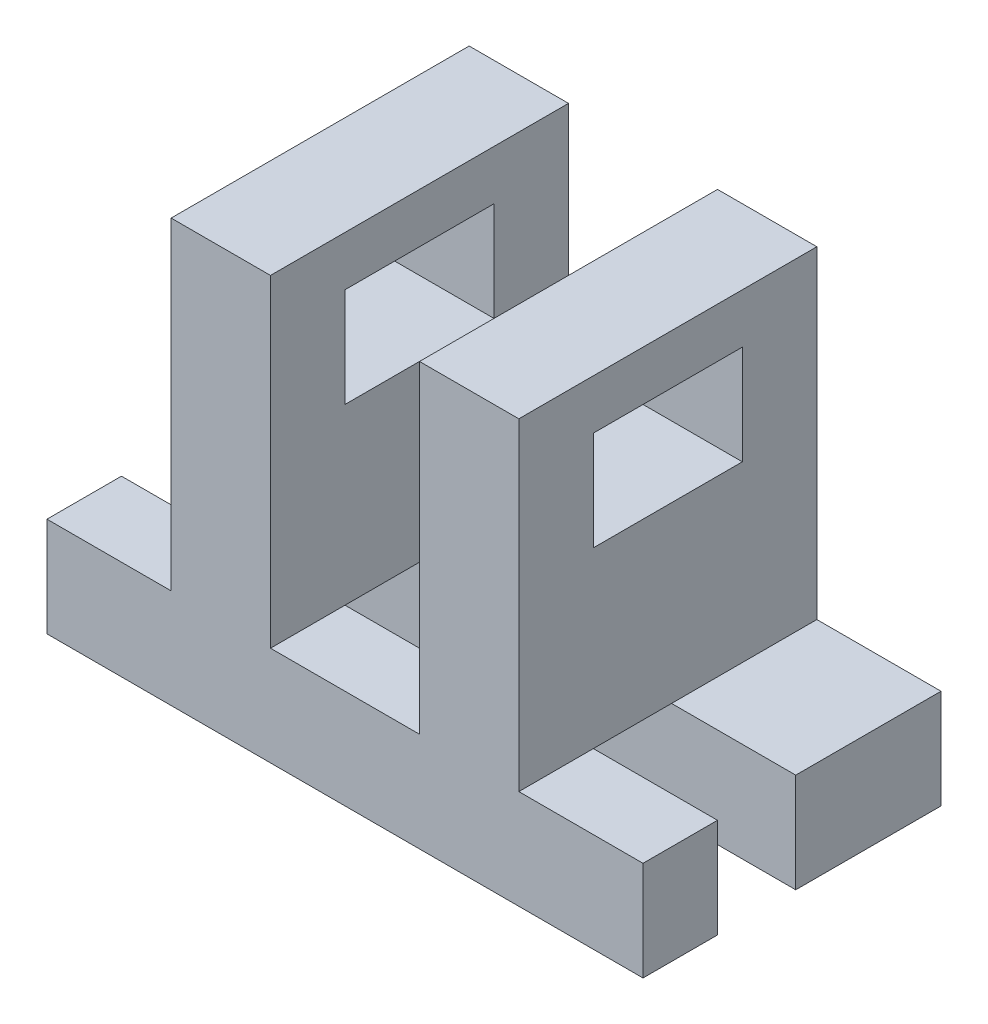
ISO-10303-21;
HEADER;
FILE_DESCRIPTION(('STEP AP214'),'2;1');
FILE_NAME('part.step','',(''),(''),'','','');
FILE_SCHEMA(('AUTOMOTIVE_DESIGN { 1 0 10303 214 1 1 1 1 }'));
ENDSEC;
DATA;
#1=APPLICATION_CONTEXT('core data for automotive mechanical design processes');
#2=APPLICATION_PROTOCOL_DEFINITION('international standard','automotive_design',2000,#1);
#3=PRODUCT_CONTEXT('',#1,'mechanical');
#4=PRODUCT('Part','Part','',(#3));
#5=PRODUCT_RELATED_PRODUCT_CATEGORY('part','',(#4));
#6=PRODUCT_DEFINITION_FORMATION('','',#4);
#7=PRODUCT_DEFINITION_CONTEXT('part definition',#1,'design');
#8=PRODUCT_DEFINITION('design','',#6,#7);
#9=PRODUCT_DEFINITION_SHAPE('','',#8);
#10=(LENGTH_UNIT() NAMED_UNIT(*) SI_UNIT(.MILLI.,.METRE.));
#11=(NAMED_UNIT(*) PLANE_ANGLE_UNIT() SI_UNIT($,.RADIAN.));
#12=(NAMED_UNIT(*) SI_UNIT($,.STERADIAN.) SOLID_ANGLE_UNIT());
#13=UNCERTAINTY_MEASURE_WITH_UNIT(LENGTH_MEASURE(1.E-05),#10,'distance_accuracy_value','');
#14=(GEOMETRIC_REPRESENTATION_CONTEXT(3) GLOBAL_UNCERTAINTY_ASSIGNED_CONTEXT((#13)) GLOBAL_UNIT_ASSIGNED_CONTEXT((#10,
#11,#12)) REPRESENTATION_CONTEXT('',''));
#15=CARTESIAN_POINT('',(0.,0.,0.));
#16=DIRECTION('',(0.,0.,1.));
#17=DIRECTION('',(1.,0.,0.));
#18=AXIS2_PLACEMENT_3D('',#15,#16,#17);
#19=CARTESIAN_POINT('',(3.5,1.,3.));
#20=DIRECTION('',(0.,-1.,0.));
#21=DIRECTION('',(1.,0.,0.));
#22=AXIS2_PLACEMENT_3D('',#19,#20,#21);
#23=PLANE('',#22);
#24=DIRECTION('',(-1.,0.,0.));
#25=VECTOR('',#24,1.);
#26=CARTESIAN_POINT('',(0.,1.,1.5));
#27=LINE('',#26,#25);
#28=CARTESIAN_POINT('',(6.,1.,1.5));
#29=VERTEX_POINT('',#28);
#30=CARTESIAN_POINT('',(3.5,1.,1.5));
#31=VERTEX_POINT('',#30);
#32=EDGE_CURVE('E268',#29,#31,#27,.T.);
#33=ORIENTED_EDGE('',*,*,#32,.T.);
#34=DIRECTION('',(0.,0.,-1.));
#35=VECTOR('',#34,1.);
#36=CARTESIAN_POINT('',(3.5,1.,3.));
#37=LINE('',#36,#35);
#38=CARTESIAN_POINT('',(3.5,1.,3.));
#39=VERTEX_POINT('',#38);
#40=EDGE_CURVE('E392',#39,#31,#37,.T.);
#41=ORIENTED_EDGE('',*,*,#40,.F.);
#42=DIRECTION('',(-1.,0.,0.));
#43=VECTOR('',#42,1.);
#44=CARTESIAN_POINT('',(3.5,1.,3.));
#45=LINE('',#44,#43);
#46=CARTESIAN_POINT('',(6.,0.999999999999999,3.));
#47=VERTEX_POINT('',#46);
#48=EDGE_CURVE('E295',#47,#39,#45,.T.);
#49=ORIENTED_EDGE('',*,*,#48,.F.);
#50=DIRECTION('',(0.,0.,-1.));
#51=VECTOR('',#50,1.);
#52=CARTESIAN_POINT('',(6.,0.999999999999999,3.));
#53=LINE('',#52,#51);
#54=EDGE_CURVE('E352',#47,#29,#53,.T.);
#55=ORIENTED_EDGE('',*,*,#54,.T.);
#56=EDGE_LOOP('',(#33,#41,#49,#55));
#57=FACE_BOUND('',#56,.T.);
#58=ADVANCED_FACE('F34',(#57),#23,.F.);
#59=CARTESIAN_POINT('',(-1.5,1.,3.));
#60=DIRECTION('',(0.,-1.,0.));
#61=DIRECTION('',(1.,0.,0.));
#62=AXIS2_PLACEMENT_3D('',#59,#60,#61);
#63=PLANE('',#62);
#64=CARTESIAN_POINT('',(1.5,1.,1.5));
#65=VERTEX_POINT('',#64);
#66=CARTESIAN_POINT('',(-1.5,1.,1.5));
#67=VERTEX_POINT('',#66);
#68=EDGE_CURVE('E483',#65,#67,#27,.T.);
#69=ORIENTED_EDGE('',*,*,#68,.T.);
#70=DIRECTION('',(0.,0.,-1.));
#71=VECTOR('',#70,1.);
#72=CARTESIAN_POINT('',(-1.5,1.,3.));
#73=LINE('',#72,#71);
#74=CARTESIAN_POINT('',(-1.5,1.,3.));
#75=VERTEX_POINT('',#74);
#76=EDGE_CURVE('E378',#75,#67,#73,.T.);
#77=ORIENTED_EDGE('',*,*,#76,.F.);
#78=DIRECTION('',(-1.,0.,0.));
#79=VECTOR('',#78,1.);
#80=CARTESIAN_POINT('',(-1.5,1.,3.));
#81=LINE('',#80,#79);
#82=CARTESIAN_POINT('',(1.5,1.,3.));
#83=VERTEX_POINT('',#82);
#84=EDGE_CURVE('E305',#83,#75,#81,.T.);
#85=ORIENTED_EDGE('',*,*,#84,.F.);
#86=DIRECTION('',(0.,0.,-1.));
#87=VECTOR('',#86,1.);
#88=CARTESIAN_POINT('',(1.5,1.,3.));
#89=LINE('',#88,#87);
#90=EDGE_CURVE('E382',#83,#65,#89,.T.);
#91=ORIENTED_EDGE('',*,*,#90,.T.);
#92=EDGE_LOOP('',(#69,#77,#85,#91));
#93=FACE_BOUND('',#92,.T.);
#94=ADVANCED_FACE('F444',(#93),#63,.F.);
#95=CARTESIAN_POINT('',(-6.,1.,3.));
#96=DIRECTION('',(0.,-1.,0.));
#97=DIRECTION('',(0.,0.,-1.));
#98=AXIS2_PLACEMENT_3D('',#95,#96,#97);
#99=PLANE('',#98);
#100=CARTESIAN_POINT('',(-3.5,1.,1.5));
#101=VERTEX_POINT('',#100);
#102=CARTESIAN_POINT('',(-6.,0.999999999999999,1.5));
#103=VERTEX_POINT('',#102);
#104=EDGE_CURVE('E265',#101,#103,#27,.T.);
#105=ORIENTED_EDGE('',*,*,#104,.T.);
#106=DIRECTION('',(0.,0.,-1.));
#107=VECTOR('',#106,1.);
#108=CARTESIAN_POINT('',(-6.,1.,3.));
#109=LINE('',#108,#107);
#110=CARTESIAN_POINT('',(-6.,1.,3.));
#111=VERTEX_POINT('',#110);
#112=EDGE_CURVE('E364',#111,#103,#109,.T.);
#113=ORIENTED_EDGE('',*,*,#112,.F.);
#114=DIRECTION('',(-1.,0.,0.));
#115=VECTOR('',#114,1.);
#116=CARTESIAN_POINT('',(-6.,1.,3.));
#117=LINE('',#116,#115);
#118=CARTESIAN_POINT('',(-3.5,1.,3.));
#119=VERTEX_POINT('',#118);
#120=EDGE_CURVE('E313',#119,#111,#117,.T.);
#121=ORIENTED_EDGE('',*,*,#120,.F.);
#122=DIRECTION('',(0.,0.,-1.));
#123=VECTOR('',#122,1.);
#124=CARTESIAN_POINT('',(-3.5,1.,3.));
#125=LINE('',#124,#123);
#126=EDGE_CURVE('E368',#119,#101,#125,.T.);
#127=ORIENTED_EDGE('',*,*,#126,.T.);
#128=EDGE_LOOP('',(#105,#113,#121,#127));
#129=FACE_BOUND('',#128,.T.);
#130=ADVANCED_FACE('F449',(#129),#99,.F.);
#131=CARTESIAN_POINT('',(-6.,-1.,3.));
#132=DIRECTION('',(1.,0.,0.));
#133=DIRECTION('',(0.,0.,-1.));
#134=AXIS2_PLACEMENT_3D('',#131,#132,#133);
#135=PLANE('',#134);
#136=DIRECTION('',(0.,-1.,0.));
#137=VECTOR('',#136,1.);
#138=CARTESIAN_POINT('',(-6.,13.1028920114161,1.5));
#139=LINE('',#138,#137);
#140=CARTESIAN_POINT('',(-6.,-1.,1.5));
#141=VERTEX_POINT('',#140);
#142=EDGE_CURVE('E277',#103,#141,#139,.T.);
#143=ORIENTED_EDGE('',*,*,#142,.T.);
#144=DIRECTION('',(0.,0.,-1.));
#145=VECTOR('',#144,1.);
#146=CARTESIAN_POINT('',(-6.,-1.,3.));
#147=LINE('',#146,#145);
#148=CARTESIAN_POINT('',(-6.,-1.,3.));
#149=VERTEX_POINT('',#148);
#150=EDGE_CURVE('E360',#149,#141,#147,.T.);
#151=ORIENTED_EDGE('',*,*,#150,.F.);
#152=DIRECTION('',(0.,-1.,0.));
#153=VECTOR('',#152,1.);
#154=CARTESIAN_POINT('',(-6.,-1.,3.));
#155=LINE('',#154,#153);
#156=EDGE_CURVE('E315',#111,#149,#155,.T.);
#157=ORIENTED_EDGE('',*,*,#156,.F.);
#158=ORIENTED_EDGE('',*,*,#112,.T.);
#159=EDGE_LOOP('',(#143,#151,#157,#158));
#160=FACE_BOUND('',#159,.T.);
#161=ADVANCED_FACE('F493',(#160),#135,.F.);
#162=CARTESIAN_POINT('',(-6.,-1.,3.));
#163=DIRECTION('',(0.,1.,0.));
#164=DIRECTION('',(-1.,0.,0.));
#165=AXIS2_PLACEMENT_3D('',#162,#163,#164);
#166=PLANE('',#165);
#167=DIRECTION('',(1.,0.,0.));
#168=VECTOR('',#167,1.);
#169=CARTESIAN_POINT('',(0.,-1.,1.5));
#170=LINE('',#169,#168);
#171=CARTESIAN_POINT('',(6.,-0.999999999999999,1.5));
#172=VERTEX_POINT('',#171);
#173=EDGE_CURVE('E261',#141,#172,#170,.T.);
#174=ORIENTED_EDGE('',*,*,#173,.T.);
#175=DIRECTION('',(0.,0.,-1.));
#176=VECTOR('',#175,1.);
#177=CARTESIAN_POINT('',(6.,-0.999999999999999,3.));
#178=LINE('',#177,#176);
#179=CARTESIAN_POINT('',(6.,-0.999999999999999,3.));
#180=VERTEX_POINT('',#179);
#181=EDGE_CURVE('E356',#180,#172,#178,.T.);
#182=ORIENTED_EDGE('',*,*,#181,.F.);
#183=DIRECTION('',(1.,0.,0.));
#184=VECTOR('',#183,1.);
#185=CARTESIAN_POINT('',(-6.,-1.,3.));
#186=LINE('',#185,#184);
#187=EDGE_CURVE('E317',#149,#180,#186,.T.);
#188=ORIENTED_EDGE('',*,*,#187,.F.);
#189=ORIENTED_EDGE('',*,*,#150,.T.);
#190=EDGE_LOOP('',(#174,#182,#188,#189));
#191=FACE_BOUND('',#190,.T.);
#192=ADVANCED_FACE('F461',(#191),#166,.F.);
#193=CARTESIAN_POINT('',(6.,-0.999999999999999,3.));
#194=DIRECTION('',(-1.,0.,0.));
#195=DIRECTION('',(0.,0.,1.));
#196=AXIS2_PLACEMENT_3D('',#193,#194,#195);
#197=PLANE('',#196);
#198=DIRECTION('',(0.,-1.,0.));
#199=VECTOR('',#198,1.);
#200=CARTESIAN_POINT('',(6.,13.1028920114161,1.5));
#201=LINE('',#200,#199);
#202=EDGE_CURVE('E278',#29,#172,#201,.T.);
#203=ORIENTED_EDGE('',*,*,#202,.F.);
#204=ORIENTED_EDGE('',*,*,#54,.F.);
#205=DIRECTION('',(0.,1.,0.));
#206=VECTOR('',#205,1.);
#207=CARTESIAN_POINT('',(6.,-0.999999999999999,3.));
#208=LINE('',#207,#206);
#209=EDGE_CURVE('E319',#180,#47,#208,.T.);
#210=ORIENTED_EDGE('',*,*,#209,.F.);
#211=ORIENTED_EDGE('',*,*,#181,.T.);
#212=EDGE_LOOP('',(#203,#204,#210,#211));
#213=FACE_BOUND('',#212,.T.);
#214=ADVANCED_FACE('F454',(#213),#197,.F.);
#215=CARTESIAN_POINT('',(3.5,1.,-0.0747999999999999));
#216=VERTEX_POINT('',#215);
#217=CARTESIAN_POINT('',(3.5,1.,-3.));
#218=VERTEX_POINT('',#217);
#219=EDGE_CURVE('E391',#216,#218,#37,.T.);
#220=ORIENTED_EDGE('',*,*,#219,.F.);
#221=DIRECTION('',(-1.,0.,0.));
#222=VECTOR('',#221,1.);
#223=CARTESIAN_POINT('',(0.,1.,-0.0747999999999999));
#224=LINE('',#223,#222);
#225=CARTESIAN_POINT('',(6.,1.,-0.0747999999999999));
#226=VERTEX_POINT('',#225);
#227=EDGE_CURVE('E262',#226,#216,#224,.T.);
#228=ORIENTED_EDGE('',*,*,#227,.F.);
#229=CARTESIAN_POINT('',(6.,0.999999999999999,-3.));
#230=VERTEX_POINT('',#229);
#231=EDGE_CURVE('E321',#226,#230,#53,.T.);
#232=ORIENTED_EDGE('',*,*,#231,.T.);
#233=DIRECTION('',(-1.,0.,0.));
#234=VECTOR('',#233,1.);
#235=CARTESIAN_POINT('',(3.5,1.,-3.));
#236=LINE('',#235,#234);
#237=EDGE_CURVE('E294',#230,#218,#236,.T.);
#238=ORIENTED_EDGE('',*,*,#237,.T.);
#239=EDGE_LOOP('',(#220,#228,#232,#238));
#240=FACE_BOUND('',#239,.T.);
#241=ADVANCED_FACE('F36',(#240),#23,.F.);
#242=CARTESIAN_POINT('',(3.5,7.5,3.));
#243=DIRECTION('',(-1.,0.,0.));
#244=DIRECTION('',(0.,-1.,0.));
#245=AXIS2_PLACEMENT_3D('',#242,#243,#244);
#246=PLANE('',#245);
#247=DIRECTION('',(0.,0.,-1.));
#248=VECTOR('',#247,1.);
#249=CARTESIAN_POINT('',(3.5,6.5,3.));
#250=LINE('',#249,#248);
#251=CARTESIAN_POINT('',(3.5,6.5,1.5));
#252=VERTEX_POINT('',#251);
#253=CARTESIAN_POINT('',(3.5,6.5,-1.5));
#254=VERTEX_POINT('',#253);
#255=EDGE_CURVE('E250',#252,#254,#250,.T.);
#256=ORIENTED_EDGE('',*,*,#255,.T.);
#257=DIRECTION('',(0.,-1.,0.));
#258=VECTOR('',#257,1.);
#259=CARTESIAN_POINT('',(3.5,7.5,-1.5));
#260=LINE('',#259,#258);
#261=CARTESIAN_POINT('',(3.5,4.5,-1.5));
#262=VERTEX_POINT('',#261);
#263=EDGE_CURVE('E258',#254,#262,#260,.T.);
#264=ORIENTED_EDGE('',*,*,#263,.T.);
#265=DIRECTION('',(0.,0.,1.));
#266=VECTOR('',#265,1.);
#267=CARTESIAN_POINT('',(3.5,4.5,3.));
#268=LINE('',#267,#266);
#269=CARTESIAN_POINT('',(3.5,4.5,1.5));
#270=VERTEX_POINT('',#269);
#271=EDGE_CURVE('E221',#262,#270,#268,.T.);
#272=ORIENTED_EDGE('',*,*,#271,.T.);
#273=DIRECTION('',(0.,1.,0.));
#274=VECTOR('',#273,1.);
#275=CARTESIAN_POINT('',(3.5,7.5,1.5));
#276=LINE('',#275,#274);
#277=EDGE_CURVE('E230',#270,#252,#276,.T.);
#278=ORIENTED_EDGE('',*,*,#277,.T.);
#279=EDGE_LOOP('',(#256,#264,#272,#278));
#280=FACE_BOUND('',#279,.T.);
#281=DIRECTION('',(0.,1.,0.));
#282=VECTOR('',#281,1.);
#283=CARTESIAN_POINT('',(3.5,7.5,-3.));
#284=LINE('',#283,#282);
#285=CARTESIAN_POINT('',(3.5,7.5,-3.));
#286=VERTEX_POINT('',#285);
#287=EDGE_CURVE('E324',#218,#286,#284,.T.);
#288=ORIENTED_EDGE('',*,*,#287,.T.);
#289=DIRECTION('',(0.,0.,-1.));
#290=VECTOR('',#289,1.);
#291=CARTESIAN_POINT('',(3.5,7.5,3.));
#292=LINE('',#291,#290);
#293=CARTESIAN_POINT('',(3.5,7.5,3.));
#294=VERTEX_POINT('',#293);
#295=EDGE_CURVE('E388',#294,#286,#292,.T.);
#296=ORIENTED_EDGE('',*,*,#295,.F.);
#297=DIRECTION('',(0.,1.,0.));
#298=VECTOR('',#297,1.);
#299=CARTESIAN_POINT('',(3.5,7.5,3.));
#300=LINE('',#299,#298);
#301=EDGE_CURVE('E298',#39,#294,#300,.T.);
#302=ORIENTED_EDGE('',*,*,#301,.F.);
#303=ORIENTED_EDGE('',*,*,#40,.T.);
#304=DIRECTION('',(0.,0.,1.));
#305=VECTOR('',#304,1.);
#306=CARTESIAN_POINT('',(3.5,1.,3.));
#307=LINE('',#306,#305);
#308=EDGE_CURVE('E292',#216,#31,#307,.T.);
#309=ORIENTED_EDGE('',*,*,#308,.F.);
#310=ORIENTED_EDGE('',*,*,#219,.T.);
#311=EDGE_LOOP('',(#288,#296,#302,#303,#309,#310));
#312=FACE_BOUND('',#311,.T.);
#313=ADVANCED_FACE('F426',(#280,#312),#246,.F.);
#314=CARTESIAN_POINT('',(1.5,7.5,3.));
#315=DIRECTION('',(0.,-1.,0.));
#316=DIRECTION('',(0.,0.,-1.));
#317=AXIS2_PLACEMENT_3D('',#314,#315,#316);
#318=PLANE('',#317);
#319=DIRECTION('',(-1.,0.,0.));
#320=VECTOR('',#319,1.);
#321=CARTESIAN_POINT('',(1.5,7.5,-3.));
#322=LINE('',#321,#320);
#323=CARTESIAN_POINT('',(1.5,7.5,-3.));
#324=VERTEX_POINT('',#323);
#325=EDGE_CURVE('E326',#286,#324,#322,.T.);
#326=ORIENTED_EDGE('',*,*,#325,.T.);
#327=DIRECTION('',(0.,0.,-1.));
#328=VECTOR('',#327,1.);
#329=CARTESIAN_POINT('',(1.5,7.5,3.));
#330=LINE('',#329,#328);
#331=CARTESIAN_POINT('',(1.5,7.5,3.));
#332=VERTEX_POINT('',#331);
#333=EDGE_CURVE('E385',#332,#324,#330,.T.);
#334=ORIENTED_EDGE('',*,*,#333,.F.);
#335=DIRECTION('',(-1.,0.,0.));
#336=VECTOR('',#335,1.);
#337=CARTESIAN_POINT('',(1.5,7.5,3.));
#338=LINE('',#337,#336);
#339=EDGE_CURVE('E301',#294,#332,#338,.T.);
#340=ORIENTED_EDGE('',*,*,#339,.F.);
#341=ORIENTED_EDGE('',*,*,#295,.T.);
#342=EDGE_LOOP('',(#326,#334,#340,#341));
#343=FACE_BOUND('',#342,.T.);
#344=ADVANCED_FACE('F460',(#343),#318,.F.);
#345=CARTESIAN_POINT('',(1.5,7.5,3.));
#346=DIRECTION('',(1.,0.,0.));
#347=DIRECTION('',(0.,1.,0.));
#348=AXIS2_PLACEMENT_3D('',#345,#346,#347);
#349=PLANE('',#348);
#350=DIRECTION('',(0.,0.,-1.));
#351=VECTOR('',#350,1.);
#352=CARTESIAN_POINT('',(1.5,4.5,3.));
#353=LINE('',#352,#351);
#354=CARTESIAN_POINT('',(1.5,4.5,1.5));
#355=VERTEX_POINT('',#354);
#356=CARTESIAN_POINT('',(1.5,4.5,-1.5));
#357=VERTEX_POINT('',#356);
#358=EDGE_CURVE('E216',#355,#357,#353,.T.);
#359=ORIENTED_EDGE('',*,*,#358,.T.);
#360=DIRECTION('',(0.,1.,0.));
#361=VECTOR('',#360,1.);
#362=CARTESIAN_POINT('',(1.5,7.5,-1.5));
#363=LINE('',#362,#361);
#364=CARTESIAN_POINT('',(1.5,6.5,-1.5));
#365=VERTEX_POINT('',#364);
#366=EDGE_CURVE('E256',#357,#365,#363,.T.);
#367=ORIENTED_EDGE('',*,*,#366,.T.);
#368=DIRECTION('',(0.,0.,1.));
#369=VECTOR('',#368,1.);
#370=CARTESIAN_POINT('',(1.5,6.5,3.));
#371=LINE('',#370,#369);
#372=CARTESIAN_POINT('',(1.5,6.5,1.5));
#373=VERTEX_POINT('',#372);
#374=EDGE_CURVE('E238',#365,#373,#371,.T.);
#375=ORIENTED_EDGE('',*,*,#374,.T.);
#376=DIRECTION('',(0.,-1.,0.));
#377=VECTOR('',#376,1.);
#378=CARTESIAN_POINT('',(1.5,7.5,1.5));
#379=LINE('',#378,#377);
#380=EDGE_CURVE('E227',#373,#355,#379,.T.);
#381=ORIENTED_EDGE('',*,*,#380,.T.);
#382=EDGE_LOOP('',(#359,#367,#375,#381));
#383=FACE_BOUND('',#382,.T.);
#384=DIRECTION('',(0.,-1.,0.));
#385=VECTOR('',#384,1.);
#386=CARTESIAN_POINT('',(1.5,7.5,-3.));
#387=LINE('',#386,#385);
#388=CARTESIAN_POINT('',(1.5,1.,-3.));
#389=VERTEX_POINT('',#388);
#390=EDGE_CURVE('E328',#324,#389,#387,.T.);
#391=ORIENTED_EDGE('',*,*,#390,.T.);
#392=CARTESIAN_POINT('',(1.5,1.,-0.0747999999999999));
#393=VERTEX_POINT('',#392);
#394=EDGE_CURVE('E381',#393,#389,#89,.T.);
#395=ORIENTED_EDGE('',*,*,#394,.F.);
#396=DIRECTION('',(0.,0.,-1.));
#397=VECTOR('',#396,1.);
#398=CARTESIAN_POINT('',(1.5,1.,3.));
#399=LINE('',#398,#397);
#400=EDGE_CURVE('E290',#65,#393,#399,.T.);
#401=ORIENTED_EDGE('',*,*,#400,.F.);
#402=ORIENTED_EDGE('',*,*,#90,.F.);
#403=DIRECTION('',(0.,-1.,0.));
#404=VECTOR('',#403,1.);
#405=CARTESIAN_POINT('',(1.5,7.5,3.));
#406=LINE('',#405,#404);
#407=EDGE_CURVE('E303',#332,#83,#406,.T.);
#408=ORIENTED_EDGE('',*,*,#407,.F.);
#409=ORIENTED_EDGE('',*,*,#333,.T.);
#410=EDGE_LOOP('',(#391,#395,#401,#402,#408,#409));
#411=FACE_BOUND('',#410,.T.);
#412=ADVANCED_FACE('F236',(#383,#411),#349,.F.);
#413=CARTESIAN_POINT('',(-1.5,1.,-0.0747999999999999));
#414=VERTEX_POINT('',#413);
#415=CARTESIAN_POINT('',(-1.5,1.,-3.));
#416=VERTEX_POINT('',#415);
#417=EDGE_CURVE('E377',#414,#416,#73,.T.);
#418=ORIENTED_EDGE('',*,*,#417,.F.);
#419=EDGE_CURVE('E523',#393,#414,#224,.T.);
#420=ORIENTED_EDGE('',*,*,#419,.F.);
#421=ORIENTED_EDGE('',*,*,#394,.T.);
#422=DIRECTION('',(-1.,0.,0.));
#423=VECTOR('',#422,1.);
#424=CARTESIAN_POINT('',(-1.5,1.,-3.));
#425=LINE('',#424,#423);
#426=EDGE_CURVE('E331',#389,#416,#425,.T.);
#427=ORIENTED_EDGE('',*,*,#426,.T.);
#428=EDGE_LOOP('',(#418,#420,#421,#427));
#429=FACE_BOUND('',#428,.T.);
#430=ADVANCED_FACE('F452',(#429),#63,.F.);
#431=CARTESIAN_POINT('',(-1.5,7.5,3.));
#432=DIRECTION('',(-1.,0.,0.));
#433=DIRECTION('',(0.,-1.,0.));
#434=AXIS2_PLACEMENT_3D('',#431,#432,#433);
#435=PLANE('',#434);
#436=DIRECTION('',(0.,0.,-1.));
#437=VECTOR('',#436,1.);
#438=CARTESIAN_POINT('',(-1.5,6.5,3.));
#439=LINE('',#438,#437);
#440=CARTESIAN_POINT('',(-1.5,6.5,1.5));
#441=VERTEX_POINT('',#440);
#442=CARTESIAN_POINT('',(-1.5,6.5,-1.5));
#443=VERTEX_POINT('',#442);
#444=EDGE_CURVE('E241',#441,#443,#439,.T.);
#445=ORIENTED_EDGE('',*,*,#444,.T.);
#446=DIRECTION('',(0.,-1.,0.));
#447=VECTOR('',#446,1.);
#448=CARTESIAN_POINT('',(-1.5,7.5,-1.5));
#449=LINE('',#448,#447);
#450=CARTESIAN_POINT('',(-1.5,4.5,-1.5));
#451=VERTEX_POINT('',#450);
#452=EDGE_CURVE('E253',#443,#451,#449,.T.);
#453=ORIENTED_EDGE('',*,*,#452,.T.);
#454=DIRECTION('',(0.,0.,1.));
#455=VECTOR('',#454,1.);
#456=CARTESIAN_POINT('',(-1.5,4.5,3.));
#457=LINE('',#456,#455);
#458=CARTESIAN_POINT('',(-1.5,4.5,1.5));
#459=VERTEX_POINT('',#458);
#460=EDGE_CURVE('E222',#451,#459,#457,.T.);
#461=ORIENTED_EDGE('',*,*,#460,.T.);
#462=DIRECTION('',(0.,1.,0.));
#463=VECTOR('',#462,1.);
#464=CARTESIAN_POINT('',(-1.5,7.5,1.5));
#465=LINE('',#464,#463);
#466=EDGE_CURVE('E239',#459,#441,#465,.T.);
#467=ORIENTED_EDGE('',*,*,#466,.T.);
#468=EDGE_LOOP('',(#445,#453,#461,#467));
#469=FACE_BOUND('',#468,.T.);
#470=DIRECTION('',(0.,1.,0.));
#471=VECTOR('',#470,1.);
#472=CARTESIAN_POINT('',(-1.5,7.5,-3.));
#473=LINE('',#472,#471);
#474=CARTESIAN_POINT('',(-1.5,7.5,-3.));
#475=VERTEX_POINT('',#474);
#476=EDGE_CURVE('E334',#416,#475,#473,.T.);
#477=ORIENTED_EDGE('',*,*,#476,.T.);
#478=DIRECTION('',(0.,0.,-1.));
#479=VECTOR('',#478,1.);
#480=CARTESIAN_POINT('',(-1.5,7.5,3.));
#481=LINE('',#480,#479);
#482=CARTESIAN_POINT('',(-1.5,7.5,3.));
#483=VERTEX_POINT('',#482);
#484=EDGE_CURVE('E374',#483,#475,#481,.T.);
#485=ORIENTED_EDGE('',*,*,#484,.F.);
#486=DIRECTION('',(0.,1.,0.));
#487=VECTOR('',#486,1.);
#488=CARTESIAN_POINT('',(-1.5,7.5,3.));
#489=LINE('',#488,#487);
#490=EDGE_CURVE('E307',#75,#483,#489,.T.);
#491=ORIENTED_EDGE('',*,*,#490,.F.);
#492=ORIENTED_EDGE('',*,*,#76,.T.);
#493=DIRECTION('',(0.,0.,1.));
#494=VECTOR('',#493,1.);
#495=CARTESIAN_POINT('',(-1.5,1.,3.));
#496=LINE('',#495,#494);
#497=EDGE_CURVE('E288',#414,#67,#496,.T.);
#498=ORIENTED_EDGE('',*,*,#497,.F.);
#499=ORIENTED_EDGE('',*,*,#417,.T.);
#500=EDGE_LOOP('',(#477,#485,#491,#492,#498,#499));
#501=FACE_BOUND('',#500,.T.);
#502=ADVANCED_FACE('F509',(#469,#501),#435,.F.);
#503=CARTESIAN_POINT('',(-1.5,7.5,3.));
#504=DIRECTION('',(0.,-1.,0.));
#505=DIRECTION('',(1.,0.,0.));
#506=AXIS2_PLACEMENT_3D('',#503,#504,#505);
#507=PLANE('',#506);
#508=DIRECTION('',(-1.,0.,0.));
#509=VECTOR('',#508,1.);
#510=CARTESIAN_POINT('',(-1.5,7.5,-3.));
#511=LINE('',#510,#509);
#512=CARTESIAN_POINT('',(-3.5,7.5,-3.));
#513=VERTEX_POINT('',#512);
#514=EDGE_CURVE('E336',#475,#513,#511,.T.);
#515=ORIENTED_EDGE('',*,*,#514,.T.);
#516=DIRECTION('',(0.,0.,-1.));
#517=VECTOR('',#516,1.);
#518=CARTESIAN_POINT('',(-3.5,7.5,3.));
#519=LINE('',#518,#517);
#520=CARTESIAN_POINT('',(-3.5,7.5,3.));
#521=VERTEX_POINT('',#520);
#522=EDGE_CURVE('E371',#521,#513,#519,.T.);
#523=ORIENTED_EDGE('',*,*,#522,.F.);
#524=DIRECTION('',(-1.,0.,0.));
#525=VECTOR('',#524,1.);
#526=CARTESIAN_POINT('',(-1.5,7.5,3.));
#527=LINE('',#526,#525);
#528=EDGE_CURVE('E309',#483,#521,#527,.T.);
#529=ORIENTED_EDGE('',*,*,#528,.F.);
#530=ORIENTED_EDGE('',*,*,#484,.T.);
#531=EDGE_LOOP('',(#515,#523,#529,#530));
#532=FACE_BOUND('',#531,.T.);
#533=ADVANCED_FACE('F557',(#532),#507,.F.);
#534=CARTESIAN_POINT('',(-3.5,7.5,3.));
#535=DIRECTION('',(1.,0.,0.));
#536=DIRECTION('',(0.,1.,0.));
#537=AXIS2_PLACEMENT_3D('',#534,#535,#536);
#538=PLANE('',#537);
#539=DIRECTION('',(0.,0.,-1.));
#540=VECTOR('',#539,1.);
#541=CARTESIAN_POINT('',(-3.5,4.5,3.));
#542=LINE('',#541,#540);
#543=CARTESIAN_POINT('',(-3.5,4.5,1.5));
#544=VERTEX_POINT('',#543);
#545=CARTESIAN_POINT('',(-3.5,4.5,-1.5));
#546=VERTEX_POINT('',#545);
#547=EDGE_CURVE('E395',#544,#546,#542,.T.);
#548=ORIENTED_EDGE('',*,*,#547,.T.);
#549=DIRECTION('',(0.,1.,0.));
#550=VECTOR('',#549,1.);
#551=CARTESIAN_POINT('',(-3.5,7.5,-1.5));
#552=LINE('',#551,#550);
#553=CARTESIAN_POINT('',(-3.5,6.5,-1.5));
#554=VERTEX_POINT('',#553);
#555=EDGE_CURVE('E11',#546,#554,#552,.T.);
#556=ORIENTED_EDGE('',*,*,#555,.T.);
#557=DIRECTION('',(0.,0.,1.));
#558=VECTOR('',#557,1.);
#559=CARTESIAN_POINT('',(-3.5,6.5,3.));
#560=LINE('',#559,#558);
#561=CARTESIAN_POINT('',(-3.5,6.5,1.5));
#562=VERTEX_POINT('',#561);
#563=EDGE_CURVE('E42',#554,#562,#560,.T.);
#564=ORIENTED_EDGE('',*,*,#563,.T.);
#565=DIRECTION('',(0.,-1.,0.));
#566=VECTOR('',#565,1.);
#567=CARTESIAN_POINT('',(-3.5,7.5,1.5));
#568=LINE('',#567,#566);
#569=EDGE_CURVE('E398',#562,#544,#568,.T.);
#570=ORIENTED_EDGE('',*,*,#569,.T.);
#571=EDGE_LOOP('',(#548,#556,#564,#570));
#572=FACE_BOUND('',#571,.T.);
#573=DIRECTION('',(0.,-1.,0.));
#574=VECTOR('',#573,1.);
#575=CARTESIAN_POINT('',(-3.5,7.5,-3.));
#576=LINE('',#575,#574);
#577=CARTESIAN_POINT('',(-3.5,1.,-3.));
#578=VERTEX_POINT('',#577);
#579=EDGE_CURVE('E338',#513,#578,#576,.T.);
#580=ORIENTED_EDGE('',*,*,#579,.T.);
#581=CARTESIAN_POINT('',(-3.5,1.,-0.0747999999999999));
#582=VERTEX_POINT('',#581);
#583=EDGE_CURVE('E367',#582,#578,#125,.T.);
#584=ORIENTED_EDGE('',*,*,#583,.F.);
#585=DIRECTION('',(0.,0.,-1.));
#586=VECTOR('',#585,1.);
#587=CARTESIAN_POINT('',(-3.5,1.,3.));
#588=LINE('',#587,#586);
#589=EDGE_CURVE('E271',#101,#582,#588,.T.);
#590=ORIENTED_EDGE('',*,*,#589,.F.);
#591=ORIENTED_EDGE('',*,*,#126,.F.);
#592=DIRECTION('',(0.,-1.,0.));
#593=VECTOR('',#592,1.);
#594=CARTESIAN_POINT('',(-3.5,7.5,3.));
#595=LINE('',#594,#593);
#596=EDGE_CURVE('E311',#521,#119,#595,.T.);
#597=ORIENTED_EDGE('',*,*,#596,.F.);
#598=ORIENTED_EDGE('',*,*,#522,.T.);
#599=EDGE_LOOP('',(#580,#584,#590,#591,#597,#598));
#600=FACE_BOUND('',#599,.T.);
#601=ADVANCED_FACE('F402',(#572,#600),#538,.F.);
#602=CARTESIAN_POINT('',(-6.,0.999999999999999,-0.0747999999999999));
#603=VERTEX_POINT('',#602);
#604=CARTESIAN_POINT('',(-6.,1.,-3.));
#605=VERTEX_POINT('',#604);
#606=EDGE_CURVE('E363',#603,#605,#109,.T.);
#607=ORIENTED_EDGE('',*,*,#606,.F.);
#608=EDGE_CURVE('E267',#582,#603,#224,.T.);
#609=ORIENTED_EDGE('',*,*,#608,.F.);
#610=ORIENTED_EDGE('',*,*,#583,.T.);
#611=DIRECTION('',(-1.,0.,0.));
#612=VECTOR('',#611,1.);
#613=CARTESIAN_POINT('',(-6.,1.,-3.));
#614=LINE('',#613,#612);
#615=EDGE_CURVE('E341',#578,#605,#614,.T.);
#616=ORIENTED_EDGE('',*,*,#615,.T.);
#617=EDGE_LOOP('',(#607,#609,#610,#616));
#618=FACE_BOUND('',#617,.T.);
#619=ADVANCED_FACE('F537',(#618),#99,.F.);
#620=CARTESIAN_POINT('',(-6.,-1.,-0.0747999999999999));
#621=VERTEX_POINT('',#620);
#622=CARTESIAN_POINT('',(-6.,-1.,-3.));
#623=VERTEX_POINT('',#622);
#624=EDGE_CURVE('E359',#621,#623,#147,.T.);
#625=ORIENTED_EDGE('',*,*,#624,.F.);
#626=DIRECTION('',(0.,-1.,0.));
#627=VECTOR('',#626,1.);
#628=CARTESIAN_POINT('',(-6.,13.1028920114161,-0.0747999999999999));
#629=LINE('',#628,#627);
#630=EDGE_CURVE('E283',#603,#621,#629,.T.);
#631=ORIENTED_EDGE('',*,*,#630,.F.);
#632=ORIENTED_EDGE('',*,*,#606,.T.);
#633=DIRECTION('',(0.,-1.,0.));
#634=VECTOR('',#633,1.);
#635=CARTESIAN_POINT('',(-6.,-1.,-3.));
#636=LINE('',#635,#634);
#637=EDGE_CURVE('E344',#605,#623,#636,.T.);
#638=ORIENTED_EDGE('',*,*,#637,.T.);
#639=EDGE_LOOP('',(#625,#631,#632,#638));
#640=FACE_BOUND('',#639,.T.);
#641=ADVANCED_FACE('F536',(#640),#135,.F.);
#642=CARTESIAN_POINT('',(6.,-0.999999999999999,-0.0747999999999999));
#643=VERTEX_POINT('',#642);
#644=CARTESIAN_POINT('',(6.,-0.999999999999999,-3.));
#645=VERTEX_POINT('',#644);
#646=EDGE_CURVE('E355',#643,#645,#178,.T.);
#647=ORIENTED_EDGE('',*,*,#646,.F.);
#648=DIRECTION('',(1.,0.,0.));
#649=VECTOR('',#648,1.);
#650=CARTESIAN_POINT('',(0.,-1.,-0.0747999999999999));
#651=LINE('',#650,#649);
#652=EDGE_CURVE('E275',#621,#643,#651,.T.);
#653=ORIENTED_EDGE('',*,*,#652,.F.);
#654=ORIENTED_EDGE('',*,*,#624,.T.);
#655=DIRECTION('',(1.,0.,0.));
#656=VECTOR('',#655,1.);
#657=CARTESIAN_POINT('',(-6.,-1.,-3.));
#658=LINE('',#657,#656);
#659=EDGE_CURVE('E347',#623,#645,#658,.T.);
#660=ORIENTED_EDGE('',*,*,#659,.T.);
#661=EDGE_LOOP('',(#647,#653,#654,#660));
#662=FACE_BOUND('',#661,.T.);
#663=ADVANCED_FACE('F547',(#662),#166,.F.);
#664=ORIENTED_EDGE('',*,*,#231,.F.);
#665=DIRECTION('',(0.,-1.,0.));
#666=VECTOR('',#665,1.);
#667=CARTESIAN_POINT('',(6.,13.1028920114161,-0.0747999999999999));
#668=LINE('',#667,#666);
#669=EDGE_CURVE('E280',#226,#643,#668,.T.);
#670=ORIENTED_EDGE('',*,*,#669,.T.);
#671=ORIENTED_EDGE('',*,*,#646,.T.);
#672=DIRECTION('',(0.,1.,0.));
#673=VECTOR('',#672,1.);
#674=CARTESIAN_POINT('',(6.,-0.999999999999999,-3.));
#675=LINE('',#674,#673);
#676=EDGE_CURVE('E299',#645,#230,#675,.T.);
#677=ORIENTED_EDGE('',*,*,#676,.T.);
#678=EDGE_LOOP('',(#664,#670,#671,#677));
#679=FACE_BOUND('',#678,.T.);
#680=ADVANCED_FACE('F464',(#679),#197,.F.);
#681=CARTESIAN_POINT('',(0.,0.,3.));
#682=DIRECTION('',(0.,0.,1.));
#683=DIRECTION('',(1.,0.,0.));
#684=AXIS2_PLACEMENT_3D('',#681,#682,#683);
#685=PLANE('',#684);
#686=ORIENTED_EDGE('',*,*,#48,.T.);
#687=ORIENTED_EDGE('',*,*,#301,.T.);
#688=ORIENTED_EDGE('',*,*,#339,.T.);
#689=ORIENTED_EDGE('',*,*,#407,.T.);
#690=ORIENTED_EDGE('',*,*,#84,.T.);
#691=ORIENTED_EDGE('',*,*,#490,.T.);
#692=ORIENTED_EDGE('',*,*,#528,.T.);
#693=ORIENTED_EDGE('',*,*,#596,.T.);
#694=ORIENTED_EDGE('',*,*,#120,.T.);
#695=ORIENTED_EDGE('',*,*,#156,.T.);
#696=ORIENTED_EDGE('',*,*,#187,.T.);
#697=ORIENTED_EDGE('',*,*,#209,.T.);
#698=EDGE_LOOP('',(#686,#687,#688,#689,#690,#691,#692,#693,#694,#695,#696,#697));
#699=FACE_BOUND('',#698,.T.);
#700=ADVANCED_FACE('F513',(#699),#685,.T.);
#701=CARTESIAN_POINT('',(0.,0.,-3.));
#702=DIRECTION('',(0.,0.,1.));
#703=DIRECTION('',(1.,0.,0.));
#704=AXIS2_PLACEMENT_3D('',#701,#702,#703);
#705=PLANE('',#704);
#706=ORIENTED_EDGE('',*,*,#237,.F.);
#707=ORIENTED_EDGE('',*,*,#676,.F.);
#708=ORIENTED_EDGE('',*,*,#659,.F.);
#709=ORIENTED_EDGE('',*,*,#637,.F.);
#710=ORIENTED_EDGE('',*,*,#615,.F.);
#711=ORIENTED_EDGE('',*,*,#579,.F.);
#712=ORIENTED_EDGE('',*,*,#514,.F.);
#713=ORIENTED_EDGE('',*,*,#476,.F.);
#714=ORIENTED_EDGE('',*,*,#426,.F.);
#715=ORIENTED_EDGE('',*,*,#390,.F.);
#716=ORIENTED_EDGE('',*,*,#325,.F.);
#717=ORIENTED_EDGE('',*,*,#287,.F.);
#718=EDGE_LOOP('',(#706,#707,#708,#709,#710,#711,#712,#713,#714,#715,#716,#717));
#719=FACE_BOUND('',#718,.T.);
#720=ADVANCED_FACE('F543',(#719),#705,.F.);
#721=CARTESIAN_POINT('',(-6.,1.,3.));
#722=DIRECTION('',(0.,-1.,0.));
#723=DIRECTION('',(0.,0.,-1.));
#724=AXIS2_PLACEMENT_3D('',#721,#722,#723);
#725=PLANE('',#724);
#726=ORIENTED_EDGE('',*,*,#308,.T.);
#727=EDGE_CURVE('E272',#31,#65,#27,.T.);
#728=ORIENTED_EDGE('',*,*,#727,.T.);
#729=ORIENTED_EDGE('',*,*,#400,.T.);
#730=EDGE_CURVE('E266',#216,#393,#224,.T.);
#731=ORIENTED_EDGE('',*,*,#730,.F.);
#732=EDGE_LOOP('',(#726,#728,#729,#731));
#733=FACE_BOUND('',#732,.T.);
#734=ADVANCED_FACE('F475',(#733),#725,.T.);
#735=ORIENTED_EDGE('',*,*,#497,.T.);
#736=EDGE_CURVE('E500',#67,#101,#27,.T.);
#737=ORIENTED_EDGE('',*,*,#736,.T.);
#738=ORIENTED_EDGE('',*,*,#589,.T.);
#739=EDGE_CURVE('E527',#414,#582,#224,.T.);
#740=ORIENTED_EDGE('',*,*,#739,.F.);
#741=EDGE_LOOP('',(#735,#737,#738,#740));
#742=FACE_BOUND('',#741,.T.);
#743=ADVANCED_FACE('F559',(#742),#725,.T.);
#744=CARTESIAN_POINT('',(0.,13.1028920114161,1.5));
#745=DIRECTION('',(0.,0.,-1.));
#746=DIRECTION('',(-1.,0.,0.));
#747=AXIS2_PLACEMENT_3D('',#744,#745,#746);
#748=PLANE('',#747);
#749=ORIENTED_EDGE('',*,*,#202,.T.);
#750=ORIENTED_EDGE('',*,*,#173,.F.);
#751=ORIENTED_EDGE('',*,*,#142,.F.);
#752=ORIENTED_EDGE('',*,*,#104,.F.);
#753=ORIENTED_EDGE('',*,*,#736,.F.);
#754=ORIENTED_EDGE('',*,*,#68,.F.);
#755=ORIENTED_EDGE('',*,*,#727,.F.);
#756=ORIENTED_EDGE('',*,*,#32,.F.);
#757=EDGE_LOOP('',(#749,#750,#751,#752,#753,#754,#755,#756));
#758=FACE_BOUND('',#757,.T.);
#759=ADVANCED_FACE('F479',(#758),#748,.T.);
#760=CARTESIAN_POINT('',(0.,13.1028920114161,-0.0747999999999999));
#761=DIRECTION('',(0.,0.,-1.));
#762=DIRECTION('',(-1.,0.,0.));
#763=AXIS2_PLACEMENT_3D('',#760,#761,#762);
#764=PLANE('',#763);
#765=ORIENTED_EDGE('',*,*,#227,.T.);
#766=ORIENTED_EDGE('',*,*,#730,.T.);
#767=ORIENTED_EDGE('',*,*,#419,.T.);
#768=ORIENTED_EDGE('',*,*,#739,.T.);
#769=ORIENTED_EDGE('',*,*,#608,.T.);
#770=ORIENTED_EDGE('',*,*,#630,.T.);
#771=ORIENTED_EDGE('',*,*,#652,.T.);
#772=ORIENTED_EDGE('',*,*,#669,.F.);
#773=EDGE_LOOP('',(#765,#766,#767,#768,#769,#770,#771,#772));
#774=FACE_BOUND('',#773,.T.);
#775=ADVANCED_FACE('F521',(#774),#764,.F.);
#776=CARTESIAN_POINT('',(6.,4.5,1.5));
#777=DIRECTION('',(0.,-1.,0.));
#778=DIRECTION('',(0.,0.,-1.));
#779=AXIS2_PLACEMENT_3D('',#776,#777,#778);
#780=PLANE('',#779);
#781=DIRECTION('',(-1.,0.,0.));
#782=VECTOR('',#781,1.);
#783=CARTESIAN_POINT('',(6.,4.5,-1.5));
#784=LINE('',#783,#782);
#785=EDGE_CURVE('E422',#451,#546,#784,.T.);
#786=ORIENTED_EDGE('',*,*,#785,.T.);
#787=ORIENTED_EDGE('',*,*,#547,.F.);
#788=DIRECTION('',(-1.,0.,0.));
#789=VECTOR('',#788,1.);
#790=CARTESIAN_POINT('',(6.,4.5,1.5));
#791=LINE('',#790,#789);
#792=EDGE_CURVE('E233',#459,#544,#791,.T.);
#793=ORIENTED_EDGE('',*,*,#792,.F.);
#794=ORIENTED_EDGE('',*,*,#460,.F.);
#795=EDGE_LOOP('',(#786,#787,#793,#794));
#796=FACE_BOUND('',#795,.T.);
#797=ADVANCED_FACE('F570',(#796),#780,.F.);
#798=CARTESIAN_POINT('',(6.,4.5,1.5));
#799=DIRECTION('',(0.,0.,1.));
#800=DIRECTION('',(1.,0.,0.));
#801=AXIS2_PLACEMENT_3D('',#798,#799,#800);
#802=PLANE('',#801);
#803=ORIENTED_EDGE('',*,*,#792,.T.);
#804=ORIENTED_EDGE('',*,*,#569,.F.);
#805=DIRECTION('',(-1.,0.,0.));
#806=VECTOR('',#805,1.);
#807=CARTESIAN_POINT('',(6.,6.5,1.5));
#808=LINE('',#807,#806);
#809=EDGE_CURVE('E232',#441,#562,#808,.T.);
#810=ORIENTED_EDGE('',*,*,#809,.F.);
#811=ORIENTED_EDGE('',*,*,#466,.F.);
#812=EDGE_LOOP('',(#803,#804,#810,#811));
#813=FACE_BOUND('',#812,.T.);
#814=ADVANCED_FACE('F440',(#813),#802,.F.);
#815=CARTESIAN_POINT('',(6.,6.5,1.5));
#816=DIRECTION('',(0.,1.,0.));
#817=DIRECTION('',(0.,0.,1.));
#818=AXIS2_PLACEMENT_3D('',#815,#816,#817);
#819=PLANE('',#818);
#820=ORIENTED_EDGE('',*,*,#809,.T.);
#821=ORIENTED_EDGE('',*,*,#563,.F.);
#822=DIRECTION('',(-1.,0.,0.));
#823=VECTOR('',#822,1.);
#824=CARTESIAN_POINT('',(6.,6.5,-1.5));
#825=LINE('',#824,#823);
#826=EDGE_CURVE('E410',#443,#554,#825,.T.);
#827=ORIENTED_EDGE('',*,*,#826,.F.);
#828=ORIENTED_EDGE('',*,*,#444,.F.);
#829=EDGE_LOOP('',(#820,#821,#827,#828));
#830=FACE_BOUND('',#829,.T.);
#831=ADVANCED_FACE('F409',(#830),#819,.F.);
#832=CARTESIAN_POINT('',(6.,4.5,-1.5));
#833=DIRECTION('',(0.,0.,-1.));
#834=DIRECTION('',(-1.,0.,0.));
#835=AXIS2_PLACEMENT_3D('',#832,#833,#834);
#836=PLANE('',#835);
#837=ORIENTED_EDGE('',*,*,#826,.T.);
#838=ORIENTED_EDGE('',*,*,#555,.F.);
#839=ORIENTED_EDGE('',*,*,#785,.F.);
#840=ORIENTED_EDGE('',*,*,#452,.F.);
#841=EDGE_LOOP('',(#837,#838,#839,#840));
#842=FACE_BOUND('',#841,.T.);
#843=ADVANCED_FACE('F413',(#842),#836,.F.);
#844=EDGE_CURVE('E415',#254,#365,#825,.T.);
#845=ORIENTED_EDGE('',*,*,#844,.T.);
#846=ORIENTED_EDGE('',*,*,#366,.F.);
#847=EDGE_CURVE('E54',#262,#357,#784,.T.);
#848=ORIENTED_EDGE('',*,*,#847,.F.);
#849=ORIENTED_EDGE('',*,*,#263,.F.);
#850=EDGE_LOOP('',(#845,#846,#848,#849));
#851=FACE_BOUND('',#850,.T.);
#852=ADVANCED_FACE('F429',(#851),#836,.F.);
#853=EDGE_CURVE('E416',#252,#373,#808,.T.);
#854=ORIENTED_EDGE('',*,*,#853,.T.);
#855=ORIENTED_EDGE('',*,*,#374,.F.);
#856=ORIENTED_EDGE('',*,*,#844,.F.);
#857=ORIENTED_EDGE('',*,*,#255,.F.);
#858=EDGE_LOOP('',(#854,#855,#856,#857));
#859=FACE_BOUND('',#858,.T.);
#860=ADVANCED_FACE('F432',(#859),#819,.F.);
#861=EDGE_CURVE('E49',#270,#355,#791,.T.);
#862=ORIENTED_EDGE('',*,*,#861,.T.);
#863=ORIENTED_EDGE('',*,*,#380,.F.);
#864=ORIENTED_EDGE('',*,*,#853,.F.);
#865=ORIENTED_EDGE('',*,*,#277,.F.);
#866=EDGE_LOOP('',(#862,#863,#864,#865));
#867=FACE_BOUND('',#866,.T.);
#868=ADVANCED_FACE('F225',(#867),#802,.F.);
#869=ORIENTED_EDGE('',*,*,#847,.T.);
#870=ORIENTED_EDGE('',*,*,#358,.F.);
#871=ORIENTED_EDGE('',*,*,#861,.F.);
#872=ORIENTED_EDGE('',*,*,#271,.F.);
#873=EDGE_LOOP('',(#869,#870,#871,#872));
#874=FACE_BOUND('',#873,.T.);
#875=ADVANCED_FACE('F217',(#874),#780,.F.);
#876=CLOSED_SHELL('',(#58,#94,#130,#161,#192,#214,#241,#313,#344,#412,#430,#502,#533,#601,#619,
#641,#663,#680,#700,#720,#734,#743,#759,#775,#797,#814,#831,#843,#852,#860,#868,#875));
#877=MANIFOLD_SOLID_BREP('B2',#876);
#878=ADVANCED_BREP_SHAPE_REPRESENTATION('',(#18,#877),#14);
#879=SHAPE_DEFINITION_REPRESENTATION(#9,#878);
ENDSEC;
END-ISO-10303-21;
